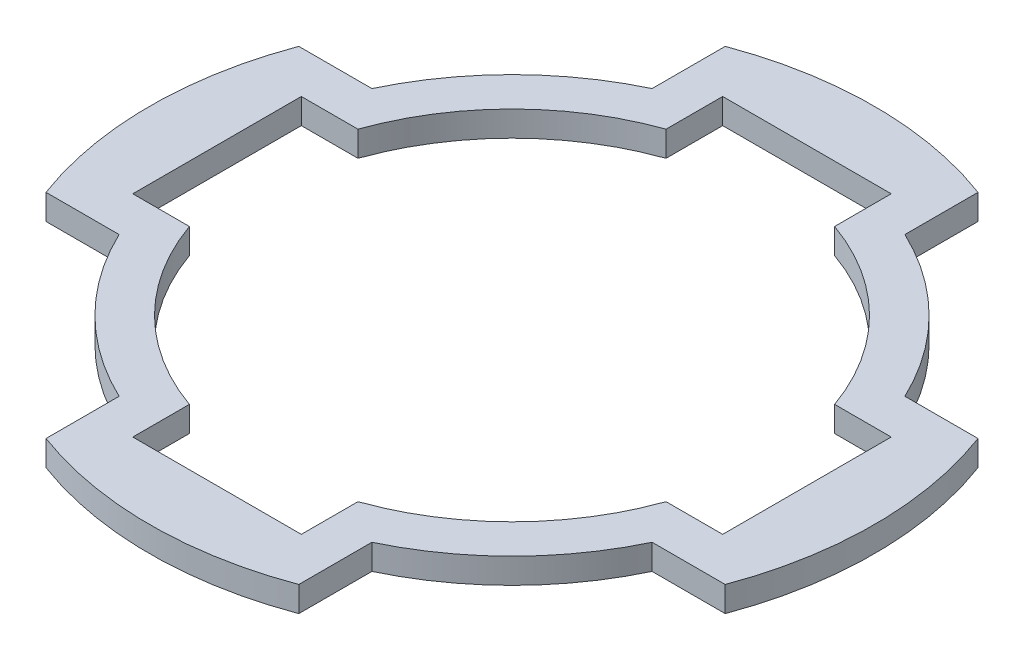
ISO-10303-21;
HEADER;
FILE_DESCRIPTION(('STEP AP214'),'2;1');
FILE_NAME('part.step','',(''),(''),'','','');
FILE_SCHEMA(('AUTOMOTIVE_DESIGN { 1 0 10303 214 1 1 1 1 }'));
ENDSEC;
DATA;
#1=APPLICATION_CONTEXT('core data for automotive mechanical design processes');
#2=APPLICATION_PROTOCOL_DEFINITION('international standard','automotive_design',2000,#1);
#3=PRODUCT_CONTEXT('',#1,'mechanical');
#4=PRODUCT('Part','Part','',(#3));
#5=PRODUCT_RELATED_PRODUCT_CATEGORY('part','',(#4));
#6=PRODUCT_DEFINITION_FORMATION('','',#4);
#7=PRODUCT_DEFINITION_CONTEXT('part definition',#1,'design');
#8=PRODUCT_DEFINITION('design','',#6,#7);
#9=PRODUCT_DEFINITION_SHAPE('','',#8);
#10=(LENGTH_UNIT() NAMED_UNIT(*) SI_UNIT(.MILLI.,.METRE.));
#11=(NAMED_UNIT(*) PLANE_ANGLE_UNIT() SI_UNIT($,.RADIAN.));
#12=(NAMED_UNIT(*) SI_UNIT($,.STERADIAN.) SOLID_ANGLE_UNIT());
#13=UNCERTAINTY_MEASURE_WITH_UNIT(LENGTH_MEASURE(1.E-05),#10,'distance_accuracy_value','');
#14=(GEOMETRIC_REPRESENTATION_CONTEXT(3) GLOBAL_UNCERTAINTY_ASSIGNED_CONTEXT((#13)) GLOBAL_UNIT_ASSIGNED_CONTEXT((#10,
#11,#12)) REPRESENTATION_CONTEXT('',''));
#15=CARTESIAN_POINT('',(0.,0.,0.));
#16=DIRECTION('',(0.,0.,1.));
#17=DIRECTION('',(1.,0.,0.));
#18=AXIS2_PLACEMENT_3D('',#15,#16,#17);
#19=CARTESIAN_POINT('',(0.,0.3,0.));
#20=DIRECTION('',(0.,1.,0.));
#21=DIRECTION('',(0.,0.,1.));
#22=AXIS2_PLACEMENT_3D('',#19,#20,#21);
#23=PLANE('',#22);
#24=CARTESIAN_POINT('',(0.,0.3,0.));
#25=DIRECTION('',(0.,1.,0.));
#26=DIRECTION('',(0.,0.,1.));
#27=AXIS2_PLACEMENT_3D('',#24,#25,#26);
#28=CIRCLE('',#27,3.5);
#29=CARTESIAN_POINT('',(-3.16227766016838,0.3,1.5));
#30=VERTEX_POINT('',#29);
#31=CARTESIAN_POINT('',(-1.5,0.3,3.16227766016838));
#32=VERTEX_POINT('',#31);
#33=EDGE_CURVE('E363',#30,#32,#28,.T.);
#34=ORIENTED_EDGE('',*,*,#33,.T.);
#35=DIRECTION('',(0.,0.,1.));
#36=VECTOR('',#35,1.);
#37=CARTESIAN_POINT('',(-1.5,0.3,3.16227766016838));
#38=LINE('',#37,#36);
#39=CARTESIAN_POINT('',(-1.5,0.3,4.02988833592198));
#40=VERTEX_POINT('',#39);
#41=EDGE_CURVE('E366',#32,#40,#38,.T.);
#42=ORIENTED_EDGE('',*,*,#41,.T.);
#43=CARTESIAN_POINT('',(0.,0.3,0.));
#44=DIRECTION('',(0.,1.,0.));
#45=DIRECTION('',(0.,0.,1.));
#46=AXIS2_PLACEMENT_3D('',#43,#44,#45);
#47=CIRCLE('',#46,4.3);
#48=CARTESIAN_POINT('',(1.5,0.3,4.02988833592198));
#49=VERTEX_POINT('',#48);
#50=EDGE_CURVE('E369',#40,#49,#47,.T.);
#51=ORIENTED_EDGE('',*,*,#50,.T.);
#52=DIRECTION('',(0.,0.,-1.));
#53=VECTOR('',#52,1.);
#54=CARTESIAN_POINT('',(1.5,0.3,3.16227766016838));
#55=LINE('',#54,#53);
#56=CARTESIAN_POINT('',(1.5,0.3,3.16227766016838));
#57=VERTEX_POINT('',#56);
#58=EDGE_CURVE('E371',#49,#57,#55,.T.);
#59=ORIENTED_EDGE('',*,*,#58,.T.);
#60=CARTESIAN_POINT('',(0.,0.3,0.));
#61=DIRECTION('',(0.,1.,0.));
#62=DIRECTION('',(0.,0.,1.));
#63=AXIS2_PLACEMENT_3D('',#60,#61,#62);
#64=CIRCLE('',#63,3.5);
#65=CARTESIAN_POINT('',(3.16227766016838,0.3,1.5));
#66=VERTEX_POINT('',#65);
#67=EDGE_CURVE('E373',#57,#66,#64,.T.);
#68=ORIENTED_EDGE('',*,*,#67,.T.);
#69=DIRECTION('',(1.,0.,0.));
#70=VECTOR('',#69,1.);
#71=CARTESIAN_POINT('',(3.16227766016838,0.3,1.5));
#72=LINE('',#71,#70);
#73=CARTESIAN_POINT('',(4.02988833592198,0.3,1.5));
#74=VERTEX_POINT('',#73);
#75=EDGE_CURVE('E375',#66,#74,#72,.T.);
#76=ORIENTED_EDGE('',*,*,#75,.T.);
#77=CARTESIAN_POINT('',(0.,0.3,0.));
#78=DIRECTION('',(0.,1.,0.));
#79=DIRECTION('',(0.,0.,1.));
#80=AXIS2_PLACEMENT_3D('',#77,#78,#79);
#81=CIRCLE('',#80,4.3);
#82=CARTESIAN_POINT('',(4.02988833592198,0.3,-1.5));
#83=VERTEX_POINT('',#82);
#84=EDGE_CURVE('E377',#74,#83,#81,.T.);
#85=ORIENTED_EDGE('',*,*,#84,.T.);
#86=DIRECTION('',(-1.,0.,0.));
#87=VECTOR('',#86,1.);
#88=CARTESIAN_POINT('',(3.16227766016838,0.3,-1.5));
#89=LINE('',#88,#87);
#90=CARTESIAN_POINT('',(3.16227766016838,0.3,-1.5));
#91=VERTEX_POINT('',#90);
#92=EDGE_CURVE('E379',#83,#91,#89,.T.);
#93=ORIENTED_EDGE('',*,*,#92,.T.);
#94=CARTESIAN_POINT('',(0.,0.3,0.));
#95=DIRECTION('',(0.,1.,0.));
#96=DIRECTION('',(0.,0.,1.));
#97=AXIS2_PLACEMENT_3D('',#94,#95,#96);
#98=CIRCLE('',#97,3.5);
#99=CARTESIAN_POINT('',(1.5,0.3,-3.16227766016838));
#100=VERTEX_POINT('',#99);
#101=EDGE_CURVE('E381',#91,#100,#98,.T.);
#102=ORIENTED_EDGE('',*,*,#101,.T.);
#103=DIRECTION('',(0.,0.,-1.));
#104=VECTOR('',#103,1.);
#105=CARTESIAN_POINT('',(1.5,0.3,-4.02988833592198));
#106=LINE('',#105,#104);
#107=CARTESIAN_POINT('',(1.5,0.3,-4.02988833592198));
#108=VERTEX_POINT('',#107);
#109=EDGE_CURVE('E383',#100,#108,#106,.T.);
#110=ORIENTED_EDGE('',*,*,#109,.T.);
#111=CARTESIAN_POINT('',(0.,0.3,0.));
#112=DIRECTION('',(0.,1.,0.));
#113=DIRECTION('',(0.,0.,1.));
#114=AXIS2_PLACEMENT_3D('',#111,#112,#113);
#115=CIRCLE('',#114,4.3);
#116=CARTESIAN_POINT('',(-1.5,0.3,-4.02988833592198));
#117=VERTEX_POINT('',#116);
#118=EDGE_CURVE('E385',#108,#117,#115,.T.);
#119=ORIENTED_EDGE('',*,*,#118,.T.);
#120=DIRECTION('',(0.,0.,1.));
#121=VECTOR('',#120,1.);
#122=CARTESIAN_POINT('',(-1.5,0.3,-4.02988833592198));
#123=LINE('',#122,#121);
#124=CARTESIAN_POINT('',(-1.5,0.3,-3.16227766016838));
#125=VERTEX_POINT('',#124);
#126=EDGE_CURVE('E387',#117,#125,#123,.T.);
#127=ORIENTED_EDGE('',*,*,#126,.T.);
#128=CARTESIAN_POINT('',(0.,0.3,0.));
#129=DIRECTION('',(0.,1.,0.));
#130=DIRECTION('',(0.,0.,1.));
#131=AXIS2_PLACEMENT_3D('',#128,#129,#130);
#132=CIRCLE('',#131,3.5);
#133=CARTESIAN_POINT('',(-3.16227766016838,0.3,-1.5));
#134=VERTEX_POINT('',#133);
#135=EDGE_CURVE('E389',#125,#134,#132,.T.);
#136=ORIENTED_EDGE('',*,*,#135,.T.);
#137=DIRECTION('',(-1.,0.,0.));
#138=VECTOR('',#137,1.);
#139=CARTESIAN_POINT('',(-4.02988833592198,0.3,-1.5));
#140=LINE('',#139,#138);
#141=CARTESIAN_POINT('',(-4.02988833592198,0.3,-1.5));
#142=VERTEX_POINT('',#141);
#143=EDGE_CURVE('E391',#134,#142,#140,.T.);
#144=ORIENTED_EDGE('',*,*,#143,.T.);
#145=CARTESIAN_POINT('',(0.,0.3,0.));
#146=DIRECTION('',(0.,1.,0.));
#147=DIRECTION('',(0.,0.,1.));
#148=AXIS2_PLACEMENT_3D('',#145,#146,#147);
#149=CIRCLE('',#148,4.3);
#150=CARTESIAN_POINT('',(-4.02988833592198,0.3,1.5));
#151=VERTEX_POINT('',#150);
#152=EDGE_CURVE('E393',#142,#151,#149,.T.);
#153=ORIENTED_EDGE('',*,*,#152,.T.);
#154=DIRECTION('',(1.,0.,0.));
#155=VECTOR('',#154,1.);
#156=CARTESIAN_POINT('',(-4.02988833592198,0.3,1.5));
#157=LINE('',#156,#155);
#158=EDGE_CURVE('E395',#151,#30,#157,.T.);
#159=ORIENTED_EDGE('',*,*,#158,.T.);
#160=EDGE_LOOP('',(#34,#42,#51,#59,#68,#76,#85,#93,#102,#110,#119,#127,#136,#144,#153,#159));
#161=FACE_BOUND('',#160,.T.);
#162=DIRECTION('',(1.,0.,0.));
#163=VECTOR('',#162,1.);
#164=CARTESIAN_POINT('',(2.82842712474619,0.3,1.));
#165=LINE('',#164,#163);
#166=CARTESIAN_POINT('',(2.82842712474619,0.3,1.));
#167=VERTEX_POINT('',#166);
#168=CARTESIAN_POINT('',(3.5,0.3,1.));
#169=VERTEX_POINT('',#168);
#170=EDGE_CURVE('E250',#167,#169,#165,.T.);
#171=ORIENTED_EDGE('',*,*,#170,.F.);
#172=CARTESIAN_POINT('',(0.,0.3,0.));
#173=DIRECTION('',(0.,1.,0.));
#174=DIRECTION('',(0.,0.,1.));
#175=AXIS2_PLACEMENT_3D('',#172,#173,#174);
#176=CIRCLE('',#175,3.);
#177=CARTESIAN_POINT('',(1.,0.3,2.82842712474619));
#178=VERTEX_POINT('',#177);
#179=EDGE_CURVE('E242',#178,#167,#176,.T.);
#180=ORIENTED_EDGE('',*,*,#179,.F.);
#181=DIRECTION('',(0.,0.,-1.));
#182=VECTOR('',#181,1.);
#183=CARTESIAN_POINT('',(1.,0.3,2.82842712474619));
#184=LINE('',#183,#182);
#185=CARTESIAN_POINT('',(1.,0.3,3.5));
#186=VERTEX_POINT('',#185);
#187=EDGE_CURVE('E291',#186,#178,#184,.T.);
#188=ORIENTED_EDGE('',*,*,#187,.F.);
#189=DIRECTION('',(1.,0.,0.));
#190=VECTOR('',#189,1.);
#191=CARTESIAN_POINT('',(-1.00000000000001,0.3,3.5));
#192=LINE('',#191,#190);
#193=CARTESIAN_POINT('',(-1.00000000000001,0.3,3.5));
#194=VERTEX_POINT('',#193);
#195=EDGE_CURVE('E289',#194,#186,#192,.T.);
#196=ORIENTED_EDGE('',*,*,#195,.F.);
#197=DIRECTION('',(0.,0.,1.));
#198=VECTOR('',#197,1.);
#199=CARTESIAN_POINT('',(-1.00000000000001,0.3,2.82842712474619));
#200=LINE('',#199,#198);
#201=CARTESIAN_POINT('',(-1.00000000000001,0.3,2.82842712474619));
#202=VERTEX_POINT('',#201);
#203=EDGE_CURVE('E287',#202,#194,#200,.T.);
#204=ORIENTED_EDGE('',*,*,#203,.F.);
#205=CARTESIAN_POINT('',(0.,0.3,0.));
#206=DIRECTION('',(0.,1.,0.));
#207=DIRECTION('',(0.,0.,1.));
#208=AXIS2_PLACEMENT_3D('',#205,#206,#207);
#209=CIRCLE('',#208,3.);
#210=CARTESIAN_POINT('',(-2.82842712474619,0.3,1.));
#211=VERTEX_POINT('',#210);
#212=EDGE_CURVE('E285',#211,#202,#209,.T.);
#213=ORIENTED_EDGE('',*,*,#212,.F.);
#214=DIRECTION('',(1.,0.,0.));
#215=VECTOR('',#214,1.);
#216=CARTESIAN_POINT('',(-3.5,0.3,1.));
#217=LINE('',#216,#215);
#218=CARTESIAN_POINT('',(-3.5,0.3,1.));
#219=VERTEX_POINT('',#218);
#220=EDGE_CURVE('E283',#219,#211,#217,.T.);
#221=ORIENTED_EDGE('',*,*,#220,.F.);
#222=DIRECTION('',(0.,0.,1.));
#223=VECTOR('',#222,1.);
#224=CARTESIAN_POINT('',(-3.5,0.3,-1.));
#225=LINE('',#224,#223);
#226=CARTESIAN_POINT('',(-3.5,0.3,-1.));
#227=VERTEX_POINT('',#226);
#228=EDGE_CURVE('E281',#227,#219,#225,.T.);
#229=ORIENTED_EDGE('',*,*,#228,.F.);
#230=DIRECTION('',(-1.,0.,0.));
#231=VECTOR('',#230,1.);
#232=CARTESIAN_POINT('',(-3.5,0.3,-1.));
#233=LINE('',#232,#231);
#234=CARTESIAN_POINT('',(-2.82842712474619,0.3,-1.));
#235=VERTEX_POINT('',#234);
#236=EDGE_CURVE('E279',#235,#227,#233,.T.);
#237=ORIENTED_EDGE('',*,*,#236,.F.);
#238=CARTESIAN_POINT('',(0.,0.3,0.));
#239=DIRECTION('',(0.,1.,0.));
#240=DIRECTION('',(0.,0.,1.));
#241=AXIS2_PLACEMENT_3D('',#238,#239,#240);
#242=CIRCLE('',#241,3.);
#243=CARTESIAN_POINT('',(-1.,0.3,-2.82842712474619));
#244=VERTEX_POINT('',#243);
#245=EDGE_CURVE('E277',#244,#235,#242,.T.);
#246=ORIENTED_EDGE('',*,*,#245,.F.);
#247=DIRECTION('',(0.,0.,1.));
#248=VECTOR('',#247,1.);
#249=CARTESIAN_POINT('',(-1.,0.3,-3.5));
#250=LINE('',#249,#248);
#251=CARTESIAN_POINT('',(-1.,0.3,-3.5));
#252=VERTEX_POINT('',#251);
#253=EDGE_CURVE('E275',#252,#244,#250,.T.);
#254=ORIENTED_EDGE('',*,*,#253,.F.);
#255=DIRECTION('',(-1.,0.,0.));
#256=VECTOR('',#255,1.);
#257=CARTESIAN_POINT('',(-1.,0.3,-3.5));
#258=LINE('',#257,#256);
#259=CARTESIAN_POINT('',(1.,0.3,-3.5));
#260=VERTEX_POINT('',#259);
#261=EDGE_CURVE('E273',#260,#252,#258,.T.);
#262=ORIENTED_EDGE('',*,*,#261,.F.);
#263=DIRECTION('',(0.,0.,-1.));
#264=VECTOR('',#263,1.);
#265=CARTESIAN_POINT('',(1.,0.3,-3.5));
#266=LINE('',#265,#264);
#267=CARTESIAN_POINT('',(0.999999999999999,0.3,-2.82842712474619));
#268=VERTEX_POINT('',#267);
#269=EDGE_CURVE('E271',#268,#260,#266,.T.);
#270=ORIENTED_EDGE('',*,*,#269,.F.);
#271=CARTESIAN_POINT('',(0.,0.3,0.));
#272=DIRECTION('',(0.,1.,0.));
#273=DIRECTION('',(0.,0.,1.));
#274=AXIS2_PLACEMENT_3D('',#271,#272,#273);
#275=CIRCLE('',#274,3.);
#276=CARTESIAN_POINT('',(2.82842712474619,0.3,-0.999999999999999));
#277=VERTEX_POINT('',#276);
#278=EDGE_CURVE('E269',#277,#268,#275,.T.);
#279=ORIENTED_EDGE('',*,*,#278,.F.);
#280=DIRECTION('',(-1.,0.,0.));
#281=VECTOR('',#280,1.);
#282=CARTESIAN_POINT('',(2.82842712474619,0.3,-0.999999999999999));
#283=LINE('',#282,#281);
#284=CARTESIAN_POINT('',(3.5,0.3,-0.999999999999999));
#285=VERTEX_POINT('',#284);
#286=EDGE_CURVE('E265',#285,#277,#283,.T.);
#287=ORIENTED_EDGE('',*,*,#286,.F.);
#288=DIRECTION('',(0.,0.,-1.));
#289=VECTOR('',#288,1.);
#290=CARTESIAN_POINT('',(3.5,0.3,-0.999999999999999));
#291=LINE('',#290,#289);
#292=EDGE_CURVE('E263',#169,#285,#291,.T.);
#293=ORIENTED_EDGE('',*,*,#292,.F.);
#294=EDGE_LOOP('',(#171,#180,#188,#196,#204,#213,#221,#229,#237,#246,#254,#262,#270,#279,#287,#293));
#295=FACE_BOUND('',#294,.T.);
#296=ADVANCED_FACE('F33',(#161,#295),#23,.T.);
#297=CARTESIAN_POINT('',(0.,0.,0.));
#298=DIRECTION('',(0.,1.,0.));
#299=DIRECTION('',(0.,0.,1.));
#300=AXIS2_PLACEMENT_3D('',#297,#298,#299);
#301=PLANE('',#300);
#302=CARTESIAN_POINT('',(0.,0.,0.));
#303=DIRECTION('',(0.,1.,0.));
#304=DIRECTION('',(0.,0.,1.));
#305=AXIS2_PLACEMENT_3D('',#302,#303,#304);
#306=CIRCLE('',#305,3.5);
#307=CARTESIAN_POINT('',(-3.16227766016838,0.,1.5));
#308=VERTEX_POINT('',#307);
#309=CARTESIAN_POINT('',(-1.5,0.,3.16227766016838));
#310=VERTEX_POINT('',#309);
#311=EDGE_CURVE('E258',#308,#310,#306,.T.);
#312=ORIENTED_EDGE('',*,*,#311,.F.);
#313=DIRECTION('',(1.,0.,0.));
#314=VECTOR('',#313,1.);
#315=CARTESIAN_POINT('',(-4.02988833592198,0.,1.5));
#316=LINE('',#315,#314);
#317=CARTESIAN_POINT('',(-4.02988833592198,0.,1.5));
#318=VERTEX_POINT('',#317);
#319=EDGE_CURVE('E367',#318,#308,#316,.T.);
#320=ORIENTED_EDGE('',*,*,#319,.F.);
#321=CARTESIAN_POINT('',(0.,0.,0.));
#322=DIRECTION('',(0.,1.,0.));
#323=DIRECTION('',(0.,0.,1.));
#324=AXIS2_PLACEMENT_3D('',#321,#322,#323);
#325=CIRCLE('',#324,4.3);
#326=CARTESIAN_POINT('',(-4.02988833592198,0.,-1.5));
#327=VERTEX_POINT('',#326);
#328=EDGE_CURVE('E426',#327,#318,#325,.T.);
#329=ORIENTED_EDGE('',*,*,#328,.F.);
#330=DIRECTION('',(-1.,0.,0.));
#331=VECTOR('',#330,1.);
#332=CARTESIAN_POINT('',(-4.02988833592198,0.,-1.5));
#333=LINE('',#332,#331);
#334=CARTESIAN_POINT('',(-3.16227766016838,0.,-1.5));
#335=VERTEX_POINT('',#334);
#336=EDGE_CURVE('E424',#335,#327,#333,.T.);
#337=ORIENTED_EDGE('',*,*,#336,.F.);
#338=CARTESIAN_POINT('',(0.,0.,0.));
#339=DIRECTION('',(0.,1.,0.));
#340=DIRECTION('',(0.,0.,1.));
#341=AXIS2_PLACEMENT_3D('',#338,#339,#340);
#342=CIRCLE('',#341,3.5);
#343=CARTESIAN_POINT('',(-1.5,0.,-3.16227766016838));
#344=VERTEX_POINT('',#343);
#345=EDGE_CURVE('E422',#344,#335,#342,.T.);
#346=ORIENTED_EDGE('',*,*,#345,.F.);
#347=DIRECTION('',(0.,0.,1.));
#348=VECTOR('',#347,1.);
#349=CARTESIAN_POINT('',(-1.5,0.,-4.02988833592198));
#350=LINE('',#349,#348);
#351=CARTESIAN_POINT('',(-1.5,0.,-4.02988833592198));
#352=VERTEX_POINT('',#351);
#353=EDGE_CURVE('E420',#352,#344,#350,.T.);
#354=ORIENTED_EDGE('',*,*,#353,.F.);
#355=CARTESIAN_POINT('',(0.,0.,0.));
#356=DIRECTION('',(0.,1.,0.));
#357=DIRECTION('',(0.,0.,1.));
#358=AXIS2_PLACEMENT_3D('',#355,#356,#357);
#359=CIRCLE('',#358,4.3);
#360=CARTESIAN_POINT('',(1.5,0.,-4.02988833592198));
#361=VERTEX_POINT('',#360);
#362=EDGE_CURVE('E418',#361,#352,#359,.T.);
#363=ORIENTED_EDGE('',*,*,#362,.F.);
#364=DIRECTION('',(0.,0.,-1.));
#365=VECTOR('',#364,1.);
#366=CARTESIAN_POINT('',(1.5,0.,-4.02988833592198));
#367=LINE('',#366,#365);
#368=CARTESIAN_POINT('',(1.5,0.,-3.16227766016838));
#369=VERTEX_POINT('',#368);
#370=EDGE_CURVE('E416',#369,#361,#367,.T.);
#371=ORIENTED_EDGE('',*,*,#370,.F.);
#372=CARTESIAN_POINT('',(0.,0.,0.));
#373=DIRECTION('',(0.,1.,0.));
#374=DIRECTION('',(0.,0.,1.));
#375=AXIS2_PLACEMENT_3D('',#372,#373,#374);
#376=CIRCLE('',#375,3.5);
#377=CARTESIAN_POINT('',(3.16227766016838,0.,-1.5));
#378=VERTEX_POINT('',#377);
#379=EDGE_CURVE('E414',#378,#369,#376,.T.);
#380=ORIENTED_EDGE('',*,*,#379,.F.);
#381=DIRECTION('',(-1.,0.,0.));
#382=VECTOR('',#381,1.);
#383=CARTESIAN_POINT('',(3.16227766016838,0.,-1.5));
#384=LINE('',#383,#382);
#385=CARTESIAN_POINT('',(4.02988833592198,0.,-1.5));
#386=VERTEX_POINT('',#385);
#387=EDGE_CURVE('E412',#386,#378,#384,.T.);
#388=ORIENTED_EDGE('',*,*,#387,.F.);
#389=CARTESIAN_POINT('',(0.,0.,0.));
#390=DIRECTION('',(0.,1.,0.));
#391=DIRECTION('',(0.,0.,1.));
#392=AXIS2_PLACEMENT_3D('',#389,#390,#391);
#393=CIRCLE('',#392,4.3);
#394=CARTESIAN_POINT('',(4.02988833592198,0.,1.5));
#395=VERTEX_POINT('',#394);
#396=EDGE_CURVE('E410',#395,#386,#393,.T.);
#397=ORIENTED_EDGE('',*,*,#396,.F.);
#398=DIRECTION('',(1.,0.,0.));
#399=VECTOR('',#398,1.);
#400=CARTESIAN_POINT('',(3.16227766016838,0.,1.5));
#401=LINE('',#400,#399);
#402=CARTESIAN_POINT('',(3.16227766016838,0.,1.5));
#403=VERTEX_POINT('',#402);
#404=EDGE_CURVE('E408',#403,#395,#401,.T.);
#405=ORIENTED_EDGE('',*,*,#404,.F.);
#406=CARTESIAN_POINT('',(0.,0.,0.));
#407=DIRECTION('',(0.,1.,0.));
#408=DIRECTION('',(0.,0.,1.));
#409=AXIS2_PLACEMENT_3D('',#406,#407,#408);
#410=CIRCLE('',#409,3.5);
#411=CARTESIAN_POINT('',(1.5,0.,3.16227766016838));
#412=VERTEX_POINT('',#411);
#413=EDGE_CURVE('E406',#412,#403,#410,.T.);
#414=ORIENTED_EDGE('',*,*,#413,.F.);
#415=DIRECTION('',(0.,0.,-1.));
#416=VECTOR('',#415,1.);
#417=CARTESIAN_POINT('',(1.5,0.,3.16227766016838));
#418=LINE('',#417,#416);
#419=CARTESIAN_POINT('',(1.5,0.,4.02988833592198));
#420=VERTEX_POINT('',#419);
#421=EDGE_CURVE('E404',#420,#412,#418,.T.);
#422=ORIENTED_EDGE('',*,*,#421,.F.);
#423=CARTESIAN_POINT('',(0.,0.,0.));
#424=DIRECTION('',(0.,1.,0.));
#425=DIRECTION('',(0.,0.,1.));
#426=AXIS2_PLACEMENT_3D('',#423,#424,#425);
#427=CIRCLE('',#426,4.3);
#428=CARTESIAN_POINT('',(-1.5,0.,4.02988833592198));
#429=VERTEX_POINT('',#428);
#430=EDGE_CURVE('E402',#429,#420,#427,.T.);
#431=ORIENTED_EDGE('',*,*,#430,.F.);
#432=DIRECTION('',(0.,0.,1.));
#433=VECTOR('',#432,1.);
#434=CARTESIAN_POINT('',(-1.5,0.,3.16227766016838));
#435=LINE('',#434,#433);
#436=EDGE_CURVE('E400',#310,#429,#435,.T.);
#437=ORIENTED_EDGE('',*,*,#436,.F.);
#438=EDGE_LOOP('',(#312,#320,#329,#337,#346,#354,#363,#371,#380,#388,#397,#405,#414,#422,#431,#437));
#439=FACE_BOUND('',#438,.T.);
#440=CARTESIAN_POINT('',(0.,0.,0.));
#441=DIRECTION('',(0.,1.,0.));
#442=DIRECTION('',(0.,0.,1.));
#443=AXIS2_PLACEMENT_3D('',#440,#441,#442);
#444=CIRCLE('',#443,3.);
#445=CARTESIAN_POINT('',(1.,0.,2.82842712474619));
#446=VERTEX_POINT('',#445);
#447=CARTESIAN_POINT('',(2.82842712474619,0.,1.));
#448=VERTEX_POINT('',#447);
#449=EDGE_CURVE('E56',#446,#448,#444,.T.);
#450=ORIENTED_EDGE('',*,*,#449,.T.);
#451=DIRECTION('',(1.,0.,0.));
#452=VECTOR('',#451,1.);
#453=CARTESIAN_POINT('',(2.82842712474619,0.,1.));
#454=LINE('',#453,#452);
#455=CARTESIAN_POINT('',(3.5,0.,1.));
#456=VERTEX_POINT('',#455);
#457=EDGE_CURVE('E257',#448,#456,#454,.T.);
#458=ORIENTED_EDGE('',*,*,#457,.T.);
#459=DIRECTION('',(0.,0.,-1.));
#460=VECTOR('',#459,1.);
#461=CARTESIAN_POINT('',(3.5,0.,-0.999999999999999));
#462=LINE('',#461,#460);
#463=CARTESIAN_POINT('',(3.5,0.,-0.999999999999999));
#464=VERTEX_POINT('',#463);
#465=EDGE_CURVE('E295',#456,#464,#462,.T.);
#466=ORIENTED_EDGE('',*,*,#465,.T.);
#467=DIRECTION('',(-1.,0.,0.));
#468=VECTOR('',#467,1.);
#469=CARTESIAN_POINT('',(2.82842712474619,0.,-0.999999999999999));
#470=LINE('',#469,#468);
#471=CARTESIAN_POINT('',(2.82842712474619,0.,-0.999999999999999));
#472=VERTEX_POINT('',#471);
#473=EDGE_CURVE('E298',#464,#472,#470,.T.);
#474=ORIENTED_EDGE('',*,*,#473,.T.);
#475=CARTESIAN_POINT('',(0.,0.,0.));
#476=DIRECTION('',(0.,1.,0.));
#477=DIRECTION('',(0.,0.,1.));
#478=AXIS2_PLACEMENT_3D('',#475,#476,#477);
#479=CIRCLE('',#478,3.);
#480=CARTESIAN_POINT('',(0.999999999999999,0.,-2.82842712474619));
#481=VERTEX_POINT('',#480);
#482=EDGE_CURVE('E301',#472,#481,#479,.T.);
#483=ORIENTED_EDGE('',*,*,#482,.T.);
#484=DIRECTION('',(0.,0.,-1.));
#485=VECTOR('',#484,1.);
#486=CARTESIAN_POINT('',(1.,0.,-3.5));
#487=LINE('',#486,#485);
#488=CARTESIAN_POINT('',(1.,0.,-3.5));
#489=VERTEX_POINT('',#488);
#490=EDGE_CURVE('E304',#481,#489,#487,.T.);
#491=ORIENTED_EDGE('',*,*,#490,.T.);
#492=DIRECTION('',(-1.,0.,0.));
#493=VECTOR('',#492,1.);
#494=CARTESIAN_POINT('',(-1.,0.,-3.5));
#495=LINE('',#494,#493);
#496=CARTESIAN_POINT('',(-1.,0.,-3.5));
#497=VERTEX_POINT('',#496);
#498=EDGE_CURVE('E307',#489,#497,#495,.T.);
#499=ORIENTED_EDGE('',*,*,#498,.T.);
#500=DIRECTION('',(0.,0.,1.));
#501=VECTOR('',#500,1.);
#502=CARTESIAN_POINT('',(-1.,0.,-3.5));
#503=LINE('',#502,#501);
#504=CARTESIAN_POINT('',(-1.,0.,-2.82842712474619));
#505=VERTEX_POINT('',#504);
#506=EDGE_CURVE('E310',#497,#505,#503,.T.);
#507=ORIENTED_EDGE('',*,*,#506,.T.);
#508=CARTESIAN_POINT('',(0.,0.,0.));
#509=DIRECTION('',(0.,1.,0.));
#510=DIRECTION('',(0.,0.,1.));
#511=AXIS2_PLACEMENT_3D('',#508,#509,#510);
#512=CIRCLE('',#511,3.);
#513=CARTESIAN_POINT('',(-2.82842712474619,0.,-1.));
#514=VERTEX_POINT('',#513);
#515=EDGE_CURVE('E313',#505,#514,#512,.T.);
#516=ORIENTED_EDGE('',*,*,#515,.T.);
#517=DIRECTION('',(-1.,0.,0.));
#518=VECTOR('',#517,1.);
#519=CARTESIAN_POINT('',(-3.5,0.,-1.));
#520=LINE('',#519,#518);
#521=CARTESIAN_POINT('',(-3.5,0.,-1.));
#522=VERTEX_POINT('',#521);
#523=EDGE_CURVE('E316',#514,#522,#520,.T.);
#524=ORIENTED_EDGE('',*,*,#523,.T.);
#525=DIRECTION('',(0.,0.,1.));
#526=VECTOR('',#525,1.);
#527=CARTESIAN_POINT('',(-3.5,0.,-1.));
#528=LINE('',#527,#526);
#529=CARTESIAN_POINT('',(-3.5,0.,1.));
#530=VERTEX_POINT('',#529);
#531=EDGE_CURVE('E319',#522,#530,#528,.T.);
#532=ORIENTED_EDGE('',*,*,#531,.T.);
#533=DIRECTION('',(1.,0.,0.));
#534=VECTOR('',#533,1.);
#535=CARTESIAN_POINT('',(-3.5,0.,1.));
#536=LINE('',#535,#534);
#537=CARTESIAN_POINT('',(-2.82842712474619,0.,1.));
#538=VERTEX_POINT('',#537);
#539=EDGE_CURVE('E322',#530,#538,#536,.T.);
#540=ORIENTED_EDGE('',*,*,#539,.T.);
#541=CARTESIAN_POINT('',(0.,0.,0.));
#542=DIRECTION('',(0.,1.,0.));
#543=DIRECTION('',(0.,0.,1.));
#544=AXIS2_PLACEMENT_3D('',#541,#542,#543);
#545=CIRCLE('',#544,3.);
#546=CARTESIAN_POINT('',(-1.00000000000001,0.,2.82842712474619));
#547=VERTEX_POINT('',#546);
#548=EDGE_CURVE('E325',#538,#547,#545,.T.);
#549=ORIENTED_EDGE('',*,*,#548,.T.);
#550=DIRECTION('',(0.,0.,1.));
#551=VECTOR('',#550,1.);
#552=CARTESIAN_POINT('',(-1.00000000000001,0.,2.82842712474619));
#553=LINE('',#552,#551);
#554=CARTESIAN_POINT('',(-1.00000000000001,0.,3.5));
#555=VERTEX_POINT('',#554);
#556=EDGE_CURVE('E328',#547,#555,#553,.T.);
#557=ORIENTED_EDGE('',*,*,#556,.T.);
#558=DIRECTION('',(1.,0.,0.));
#559=VECTOR('',#558,1.);
#560=CARTESIAN_POINT('',(-1.00000000000001,0.,3.5));
#561=LINE('',#560,#559);
#562=CARTESIAN_POINT('',(1.,0.,3.5));
#563=VERTEX_POINT('',#562);
#564=EDGE_CURVE('E331',#555,#563,#561,.T.);
#565=ORIENTED_EDGE('',*,*,#564,.T.);
#566=DIRECTION('',(0.,0.,-1.));
#567=VECTOR('',#566,1.);
#568=CARTESIAN_POINT('',(1.,0.,2.82842712474619));
#569=LINE('',#568,#567);
#570=EDGE_CURVE('E251',#563,#446,#569,.T.);
#571=ORIENTED_EDGE('',*,*,#570,.T.);
#572=EDGE_LOOP('',(#450,#458,#466,#474,#483,#491,#499,#507,#516,#524,#532,#540,#549,#557,#565,#571));
#573=FACE_BOUND('',#572,.T.);
#574=ADVANCED_FACE('F480',(#439,#573),#301,.F.);
#575=CARTESIAN_POINT('',(0.,0.3,0.));
#576=DIRECTION('',(0.,-1.,0.));
#577=DIRECTION('',(0.,0.,-1.));
#578=AXIS2_PLACEMENT_3D('',#575,#576,#577);
#579=CYLINDRICAL_SURFACE('',#578,3.5);
#580=ORIENTED_EDGE('',*,*,#311,.T.);
#581=DIRECTION('',(0.,-1.,0.));
#582=VECTOR('',#581,1.);
#583=CARTESIAN_POINT('',(-1.5,0.3,3.16227766016838));
#584=LINE('',#583,#582);
#585=EDGE_CURVE('E11',#32,#310,#584,.T.);
#586=ORIENTED_EDGE('',*,*,#585,.F.);
#587=ORIENTED_EDGE('',*,*,#33,.F.);
#588=DIRECTION('',(0.,-1.,0.));
#589=VECTOR('',#588,1.);
#590=CARTESIAN_POINT('',(-3.16227766016838,0.3,1.5));
#591=LINE('',#590,#589);
#592=EDGE_CURVE('E397',#30,#308,#591,.T.);
#593=ORIENTED_EDGE('',*,*,#592,.T.);
#594=EDGE_LOOP('',(#580,#586,#587,#593));
#595=FACE_BOUND('',#594,.T.);
#596=ADVANCED_FACE('F35',(#595),#579,.T.);
#597=CARTESIAN_POINT('',(-1.5,0.3,3.16227766016838));
#598=DIRECTION('',(1.,0.,0.));
#599=DIRECTION('',(0.,0.,-1.));
#600=AXIS2_PLACEMENT_3D('',#597,#598,#599);
#601=PLANE('',#600);
#602=ORIENTED_EDGE('',*,*,#436,.T.);
#603=DIRECTION('',(0.,-1.,0.));
#604=VECTOR('',#603,1.);
#605=CARTESIAN_POINT('',(-1.5,0.3,4.02988833592198));
#606=LINE('',#605,#604);
#607=EDGE_CURVE('E41',#40,#429,#606,.T.);
#608=ORIENTED_EDGE('',*,*,#607,.F.);
#609=ORIENTED_EDGE('',*,*,#41,.F.);
#610=ORIENTED_EDGE('',*,*,#585,.T.);
#611=EDGE_LOOP('',(#602,#608,#609,#610));
#612=FACE_BOUND('',#611,.T.);
#613=ADVANCED_FACE('F497',(#612),#601,.F.);
#614=CARTESIAN_POINT('',(0.,0.3,0.));
#615=DIRECTION('',(0.,-1.,0.));
#616=DIRECTION('',(0.,0.,-1.));
#617=AXIS2_PLACEMENT_3D('',#614,#615,#616);
#618=CYLINDRICAL_SURFACE('',#617,4.3);
#619=ORIENTED_EDGE('',*,*,#430,.T.);
#620=DIRECTION('',(0.,-1.,0.));
#621=VECTOR('',#620,1.);
#622=CARTESIAN_POINT('',(1.5,0.3,4.02988833592198));
#623=LINE('',#622,#621);
#624=EDGE_CURVE('E467',#49,#420,#623,.T.);
#625=ORIENTED_EDGE('',*,*,#624,.F.);
#626=ORIENTED_EDGE('',*,*,#50,.F.);
#627=ORIENTED_EDGE('',*,*,#607,.T.);
#628=EDGE_LOOP('',(#619,#625,#626,#627));
#629=FACE_BOUND('',#628,.T.);
#630=ADVANCED_FACE('F474',(#629),#618,.T.);
#631=CARTESIAN_POINT('',(1.5,0.3,3.16227766016838));
#632=DIRECTION('',(-1.,0.,0.));
#633=DIRECTION('',(0.,0.,1.));
#634=AXIS2_PLACEMENT_3D('',#631,#632,#633);
#635=PLANE('',#634);
#636=ORIENTED_EDGE('',*,*,#421,.T.);
#637=DIRECTION('',(0.,-1.,0.));
#638=VECTOR('',#637,1.);
#639=CARTESIAN_POINT('',(1.5,0.3,3.16227766016838));
#640=LINE('',#639,#638);
#641=EDGE_CURVE('E464',#57,#412,#640,.T.);
#642=ORIENTED_EDGE('',*,*,#641,.F.);
#643=ORIENTED_EDGE('',*,*,#58,.F.);
#644=ORIENTED_EDGE('',*,*,#624,.T.);
#645=EDGE_LOOP('',(#636,#642,#643,#644));
#646=FACE_BOUND('',#645,.T.);
#647=ADVANCED_FACE('F486',(#646),#635,.F.);
#648=CARTESIAN_POINT('',(0.,0.3,0.));
#649=DIRECTION('',(0.,-1.,0.));
#650=DIRECTION('',(0.,0.,-1.));
#651=AXIS2_PLACEMENT_3D('',#648,#649,#650);
#652=CYLINDRICAL_SURFACE('',#651,3.5);
#653=ORIENTED_EDGE('',*,*,#413,.T.);
#654=DIRECTION('',(0.,-1.,0.));
#655=VECTOR('',#654,1.);
#656=CARTESIAN_POINT('',(3.16227766016838,0.3,1.5));
#657=LINE('',#656,#655);
#658=EDGE_CURVE('E461',#66,#403,#657,.T.);
#659=ORIENTED_EDGE('',*,*,#658,.F.);
#660=ORIENTED_EDGE('',*,*,#67,.F.);
#661=ORIENTED_EDGE('',*,*,#641,.T.);
#662=EDGE_LOOP('',(#653,#659,#660,#661));
#663=FACE_BOUND('',#662,.T.);
#664=ADVANCED_FACE('F490',(#663),#652,.T.);
#665=CARTESIAN_POINT('',(3.16227766016838,0.3,1.5));
#666=DIRECTION('',(0.,0.,-1.));
#667=DIRECTION('',(-1.,0.,0.));
#668=AXIS2_PLACEMENT_3D('',#665,#666,#667);
#669=PLANE('',#668);
#670=ORIENTED_EDGE('',*,*,#404,.T.);
#671=DIRECTION('',(0.,-1.,0.));
#672=VECTOR('',#671,1.);
#673=CARTESIAN_POINT('',(4.02988833592198,0.3,1.5));
#674=LINE('',#673,#672);
#675=EDGE_CURVE('E458',#74,#395,#674,.T.);
#676=ORIENTED_EDGE('',*,*,#675,.F.);
#677=ORIENTED_EDGE('',*,*,#75,.F.);
#678=ORIENTED_EDGE('',*,*,#658,.T.);
#679=EDGE_LOOP('',(#670,#676,#677,#678));
#680=FACE_BOUND('',#679,.T.);
#681=ADVANCED_FACE('F550',(#680),#669,.F.);
#682=CARTESIAN_POINT('',(0.,0.3,0.));
#683=DIRECTION('',(0.,-1.,0.));
#684=DIRECTION('',(0.,0.,-1.));
#685=AXIS2_PLACEMENT_3D('',#682,#683,#684);
#686=CYLINDRICAL_SURFACE('',#685,4.3);
#687=ORIENTED_EDGE('',*,*,#396,.T.);
#688=DIRECTION('',(0.,-1.,0.));
#689=VECTOR('',#688,1.);
#690=CARTESIAN_POINT('',(4.02988833592198,0.3,-1.5));
#691=LINE('',#690,#689);
#692=EDGE_CURVE('E455',#83,#386,#691,.T.);
#693=ORIENTED_EDGE('',*,*,#692,.F.);
#694=ORIENTED_EDGE('',*,*,#84,.F.);
#695=ORIENTED_EDGE('',*,*,#675,.T.);
#696=EDGE_LOOP('',(#687,#693,#694,#695));
#697=FACE_BOUND('',#696,.T.);
#698=ADVANCED_FACE('F547',(#697),#686,.T.);
#699=CARTESIAN_POINT('',(3.16227766016838,0.3,-1.5));
#700=DIRECTION('',(0.,0.,1.));
#701=DIRECTION('',(1.,0.,0.));
#702=AXIS2_PLACEMENT_3D('',#699,#700,#701);
#703=PLANE('',#702);
#704=ORIENTED_EDGE('',*,*,#387,.T.);
#705=DIRECTION('',(0.,-1.,0.));
#706=VECTOR('',#705,1.);
#707=CARTESIAN_POINT('',(3.16227766016838,0.3,-1.5));
#708=LINE('',#707,#706);
#709=EDGE_CURVE('E452',#91,#378,#708,.T.);
#710=ORIENTED_EDGE('',*,*,#709,.F.);
#711=ORIENTED_EDGE('',*,*,#92,.F.);
#712=ORIENTED_EDGE('',*,*,#692,.T.);
#713=EDGE_LOOP('',(#704,#710,#711,#712));
#714=FACE_BOUND('',#713,.T.);
#715=ADVANCED_FACE('F543',(#714),#703,.F.);
#716=CARTESIAN_POINT('',(0.,0.3,0.));
#717=DIRECTION('',(0.,-1.,0.));
#718=DIRECTION('',(0.,0.,-1.));
#719=AXIS2_PLACEMENT_3D('',#716,#717,#718);
#720=CYLINDRICAL_SURFACE('',#719,3.5);
#721=ORIENTED_EDGE('',*,*,#379,.T.);
#722=DIRECTION('',(0.,-1.,0.));
#723=VECTOR('',#722,1.);
#724=CARTESIAN_POINT('',(1.5,0.3,-3.16227766016838));
#725=LINE('',#724,#723);
#726=EDGE_CURVE('E449',#100,#369,#725,.T.);
#727=ORIENTED_EDGE('',*,*,#726,.F.);
#728=ORIENTED_EDGE('',*,*,#101,.F.);
#729=ORIENTED_EDGE('',*,*,#709,.T.);
#730=EDGE_LOOP('',(#721,#727,#728,#729));
#731=FACE_BOUND('',#730,.T.);
#732=ADVANCED_FACE('F539',(#731),#720,.T.);
#733=CARTESIAN_POINT('',(1.5,0.3,-4.02988833592198));
#734=DIRECTION('',(-1.,0.,0.));
#735=DIRECTION('',(0.,0.,1.));
#736=AXIS2_PLACEMENT_3D('',#733,#734,#735);
#737=PLANE('',#736);
#738=ORIENTED_EDGE('',*,*,#370,.T.);
#739=DIRECTION('',(0.,-1.,0.));
#740=VECTOR('',#739,1.);
#741=CARTESIAN_POINT('',(1.5,0.3,-4.02988833592198));
#742=LINE('',#741,#740);
#743=EDGE_CURVE('E446',#108,#361,#742,.T.);
#744=ORIENTED_EDGE('',*,*,#743,.F.);
#745=ORIENTED_EDGE('',*,*,#109,.F.);
#746=ORIENTED_EDGE('',*,*,#726,.T.);
#747=EDGE_LOOP('',(#738,#744,#745,#746));
#748=FACE_BOUND('',#747,.T.);
#749=ADVANCED_FACE('F534',(#748),#737,.F.);
#750=CARTESIAN_POINT('',(0.,0.3,0.));
#751=DIRECTION('',(0.,-1.,0.));
#752=DIRECTION('',(0.,0.,-1.));
#753=AXIS2_PLACEMENT_3D('',#750,#751,#752);
#754=CYLINDRICAL_SURFACE('',#753,4.3);
#755=ORIENTED_EDGE('',*,*,#362,.T.);
#756=DIRECTION('',(0.,-1.,0.));
#757=VECTOR('',#756,1.);
#758=CARTESIAN_POINT('',(-1.5,0.3,-4.02988833592198));
#759=LINE('',#758,#757);
#760=EDGE_CURVE('E443',#117,#352,#759,.T.);
#761=ORIENTED_EDGE('',*,*,#760,.F.);
#762=ORIENTED_EDGE('',*,*,#118,.F.);
#763=ORIENTED_EDGE('',*,*,#743,.T.);
#764=EDGE_LOOP('',(#755,#761,#762,#763));
#765=FACE_BOUND('',#764,.T.);
#766=ADVANCED_FACE('F528',(#765),#754,.T.);
#767=CARTESIAN_POINT('',(-1.5,0.3,-4.02988833592198));
#768=DIRECTION('',(1.,0.,0.));
#769=DIRECTION('',(0.,0.,-1.));
#770=AXIS2_PLACEMENT_3D('',#767,#768,#769);
#771=PLANE('',#770);
#772=ORIENTED_EDGE('',*,*,#353,.T.);
#773=DIRECTION('',(0.,-1.,0.));
#774=VECTOR('',#773,1.);
#775=CARTESIAN_POINT('',(-1.5,0.3,-3.16227766016838));
#776=LINE('',#775,#774);
#777=EDGE_CURVE('E440',#125,#344,#776,.T.);
#778=ORIENTED_EDGE('',*,*,#777,.F.);
#779=ORIENTED_EDGE('',*,*,#126,.F.);
#780=ORIENTED_EDGE('',*,*,#760,.T.);
#781=EDGE_LOOP('',(#772,#778,#779,#780));
#782=FACE_BOUND('',#781,.T.);
#783=ADVANCED_FACE('F524',(#782),#771,.F.);
#784=CARTESIAN_POINT('',(0.,0.3,0.));
#785=DIRECTION('',(0.,-1.,0.));
#786=DIRECTION('',(0.,0.,-1.));
#787=AXIS2_PLACEMENT_3D('',#784,#785,#786);
#788=CYLINDRICAL_SURFACE('',#787,3.5);
#789=ORIENTED_EDGE('',*,*,#345,.T.);
#790=DIRECTION('',(0.,-1.,0.));
#791=VECTOR('',#790,1.);
#792=CARTESIAN_POINT('',(-3.16227766016838,0.3,-1.5));
#793=LINE('',#792,#791);
#794=EDGE_CURVE('E437',#134,#335,#793,.T.);
#795=ORIENTED_EDGE('',*,*,#794,.F.);
#796=ORIENTED_EDGE('',*,*,#135,.F.);
#797=ORIENTED_EDGE('',*,*,#777,.T.);
#798=EDGE_LOOP('',(#789,#795,#796,#797));
#799=FACE_BOUND('',#798,.T.);
#800=ADVANCED_FACE('F519',(#799),#788,.T.);
#801=CARTESIAN_POINT('',(-4.02988833592198,0.3,-1.5));
#802=DIRECTION('',(0.,0.,1.));
#803=DIRECTION('',(1.,0.,0.));
#804=AXIS2_PLACEMENT_3D('',#801,#802,#803);
#805=PLANE('',#804);
#806=ORIENTED_EDGE('',*,*,#336,.T.);
#807=DIRECTION('',(0.,-1.,0.));
#808=VECTOR('',#807,1.);
#809=CARTESIAN_POINT('',(-4.02988833592198,0.3,-1.5));
#810=LINE('',#809,#808);
#811=EDGE_CURVE('E434',#142,#327,#810,.T.);
#812=ORIENTED_EDGE('',*,*,#811,.F.);
#813=ORIENTED_EDGE('',*,*,#143,.F.);
#814=ORIENTED_EDGE('',*,*,#794,.T.);
#815=EDGE_LOOP('',(#806,#812,#813,#814));
#816=FACE_BOUND('',#815,.T.);
#817=ADVANCED_FACE('F513',(#816),#805,.F.);
#818=CARTESIAN_POINT('',(0.,0.3,0.));
#819=DIRECTION('',(0.,-1.,0.));
#820=DIRECTION('',(0.,0.,-1.));
#821=AXIS2_PLACEMENT_3D('',#818,#819,#820);
#822=CYLINDRICAL_SURFACE('',#821,4.3);
#823=ORIENTED_EDGE('',*,*,#328,.T.);
#824=DIRECTION('',(0.,-1.,0.));
#825=VECTOR('',#824,1.);
#826=CARTESIAN_POINT('',(-4.02988833592198,0.3,1.5));
#827=LINE('',#826,#825);
#828=EDGE_CURVE('E431',#151,#318,#827,.T.);
#829=ORIENTED_EDGE('',*,*,#828,.F.);
#830=ORIENTED_EDGE('',*,*,#152,.F.);
#831=ORIENTED_EDGE('',*,*,#811,.T.);
#832=EDGE_LOOP('',(#823,#829,#830,#831));
#833=FACE_BOUND('',#832,.T.);
#834=ADVANCED_FACE('F509',(#833),#822,.T.);
#835=CARTESIAN_POINT('',(-4.02988833592198,0.3,1.5));
#836=DIRECTION('',(0.,0.,-1.));
#837=DIRECTION('',(-1.,0.,0.));
#838=AXIS2_PLACEMENT_3D('',#835,#836,#837);
#839=PLANE('',#838);
#840=ORIENTED_EDGE('',*,*,#319,.T.);
#841=ORIENTED_EDGE('',*,*,#592,.F.);
#842=ORIENTED_EDGE('',*,*,#158,.F.);
#843=ORIENTED_EDGE('',*,*,#828,.T.);
#844=EDGE_LOOP('',(#840,#841,#842,#843));
#845=FACE_BOUND('',#844,.T.);
#846=ADVANCED_FACE('F504',(#845),#839,.F.);
#847=CARTESIAN_POINT('',(0.,0.3,0.));
#848=DIRECTION('',(0.,-1.,0.));
#849=DIRECTION('',(0.,0.,-1.));
#850=AXIS2_PLACEMENT_3D('',#847,#848,#849);
#851=CYLINDRICAL_SURFACE('',#850,3.);
#852=ORIENTED_EDGE('',*,*,#449,.F.);
#853=DIRECTION('',(0.,-1.,0.));
#854=VECTOR('',#853,1.);
#855=CARTESIAN_POINT('',(1.,0.3,2.82842712474619));
#856=LINE('',#855,#854);
#857=EDGE_CURVE('E246',#178,#446,#856,.T.);
#858=ORIENTED_EDGE('',*,*,#857,.F.);
#859=ORIENTED_EDGE('',*,*,#179,.T.);
#860=DIRECTION('',(0.,-1.,0.));
#861=VECTOR('',#860,1.);
#862=CARTESIAN_POINT('',(2.82842712474619,0.3,1.));
#863=LINE('',#862,#861);
#864=EDGE_CURVE('E245',#167,#448,#863,.T.);
#865=ORIENTED_EDGE('',*,*,#864,.T.);
#866=EDGE_LOOP('',(#852,#858,#859,#865));
#867=FACE_BOUND('',#866,.T.);
#868=ADVANCED_FACE('F244',(#867),#851,.F.);
#869=CARTESIAN_POINT('',(2.82842712474619,0.3,1.));
#870=DIRECTION('',(0.,0.,-1.));
#871=DIRECTION('',(-1.,0.,0.));
#872=AXIS2_PLACEMENT_3D('',#869,#870,#871);
#873=PLANE('',#872);
#874=ORIENTED_EDGE('',*,*,#457,.F.);
#875=ORIENTED_EDGE('',*,*,#864,.F.);
#876=ORIENTED_EDGE('',*,*,#170,.T.);
#877=DIRECTION('',(0.,-1.,0.));
#878=VECTOR('',#877,1.);
#879=CARTESIAN_POINT('',(3.5,0.3,1.));
#880=LINE('',#879,#878);
#881=EDGE_CURVE('E259',#169,#456,#880,.T.);
#882=ORIENTED_EDGE('',*,*,#881,.T.);
#883=EDGE_LOOP('',(#874,#875,#876,#882));
#884=FACE_BOUND('',#883,.T.);
#885=ADVANCED_FACE('F254',(#884),#873,.T.);
#886=CARTESIAN_POINT('',(3.5,0.3,-0.999999999999999));
#887=DIRECTION('',(-1.,0.,0.));
#888=DIRECTION('',(0.,0.,1.));
#889=AXIS2_PLACEMENT_3D('',#886,#887,#888);
#890=PLANE('',#889);
#891=ORIENTED_EDGE('',*,*,#465,.F.);
#892=ORIENTED_EDGE('',*,*,#881,.F.);
#893=ORIENTED_EDGE('',*,*,#292,.T.);
#894=DIRECTION('',(0.,-1.,0.));
#895=VECTOR('',#894,1.);
#896=CARTESIAN_POINT('',(3.5,0.3,-0.999999999999999));
#897=LINE('',#896,#895);
#898=EDGE_CURVE('E360',#285,#464,#897,.T.);
#899=ORIENTED_EDGE('',*,*,#898,.T.);
#900=EDGE_LOOP('',(#891,#892,#893,#899));
#901=FACE_BOUND('',#900,.T.);
#902=ADVANCED_FACE('F632',(#901),#890,.T.);
#903=CARTESIAN_POINT('',(2.82842712474619,0.3,-0.999999999999999));
#904=DIRECTION('',(0.,0.,1.));
#905=DIRECTION('',(1.,0.,0.));
#906=AXIS2_PLACEMENT_3D('',#903,#904,#905);
#907=PLANE('',#906);
#908=ORIENTED_EDGE('',*,*,#473,.F.);
#909=ORIENTED_EDGE('',*,*,#898,.F.);
#910=ORIENTED_EDGE('',*,*,#286,.T.);
#911=DIRECTION('',(0.,-1.,0.));
#912=VECTOR('',#911,1.);
#913=CARTESIAN_POINT('',(2.82842712474619,0.3,-0.999999999999999));
#914=LINE('',#913,#912);
#915=EDGE_CURVE('E358',#277,#472,#914,.T.);
#916=ORIENTED_EDGE('',*,*,#915,.T.);
#917=EDGE_LOOP('',(#908,#909,#910,#916));
#918=FACE_BOUND('',#917,.T.);
#919=ADVANCED_FACE('F638',(#918),#907,.T.);
#920=CARTESIAN_POINT('',(0.,0.3,0.));
#921=DIRECTION('',(0.,-1.,0.));
#922=DIRECTION('',(0.,0.,-1.));
#923=AXIS2_PLACEMENT_3D('',#920,#921,#922);
#924=CYLINDRICAL_SURFACE('',#923,3.);
#925=ORIENTED_EDGE('',*,*,#482,.F.);
#926=ORIENTED_EDGE('',*,*,#915,.F.);
#927=ORIENTED_EDGE('',*,*,#278,.T.);
#928=DIRECTION('',(0.,-1.,0.));
#929=VECTOR('',#928,1.);
#930=CARTESIAN_POINT('',(0.999999999999999,0.3,-2.82842712474619));
#931=LINE('',#930,#929);
#932=EDGE_CURVE('E356',#268,#481,#931,.T.);
#933=ORIENTED_EDGE('',*,*,#932,.T.);
#934=EDGE_LOOP('',(#925,#926,#927,#933));
#935=FACE_BOUND('',#934,.T.);
#936=ADVANCED_FACE('F646',(#935),#924,.F.);
#937=CARTESIAN_POINT('',(1.,0.3,-3.5));
#938=DIRECTION('',(-1.,0.,0.));
#939=DIRECTION('',(0.,0.,1.));
#940=AXIS2_PLACEMENT_3D('',#937,#938,#939);
#941=PLANE('',#940);
#942=ORIENTED_EDGE('',*,*,#490,.F.);
#943=ORIENTED_EDGE('',*,*,#932,.F.);
#944=ORIENTED_EDGE('',*,*,#269,.T.);
#945=DIRECTION('',(0.,-1.,0.));
#946=VECTOR('',#945,1.);
#947=CARTESIAN_POINT('',(1.,0.3,-3.5));
#948=LINE('',#947,#946);
#949=EDGE_CURVE('E354',#260,#489,#948,.T.);
#950=ORIENTED_EDGE('',*,*,#949,.T.);
#951=EDGE_LOOP('',(#942,#943,#944,#950));
#952=FACE_BOUND('',#951,.T.);
#953=ADVANCED_FACE('F654',(#952),#941,.T.);
#954=CARTESIAN_POINT('',(-1.,0.3,-3.5));
#955=DIRECTION('',(0.,0.,1.));
#956=DIRECTION('',(1.,0.,0.));
#957=AXIS2_PLACEMENT_3D('',#954,#955,#956);
#958=PLANE('',#957);
#959=ORIENTED_EDGE('',*,*,#498,.F.);
#960=ORIENTED_EDGE('',*,*,#949,.F.);
#961=ORIENTED_EDGE('',*,*,#261,.T.);
#962=DIRECTION('',(0.,-1.,0.));
#963=VECTOR('',#962,1.);
#964=CARTESIAN_POINT('',(-1.,0.3,-3.5));
#965=LINE('',#964,#963);
#966=EDGE_CURVE('E352',#252,#497,#965,.T.);
#967=ORIENTED_EDGE('',*,*,#966,.T.);
#968=EDGE_LOOP('',(#959,#960,#961,#967));
#969=FACE_BOUND('',#968,.T.);
#970=ADVANCED_FACE('F662',(#969),#958,.T.);
#971=CARTESIAN_POINT('',(-1.,0.3,-3.5));
#972=DIRECTION('',(1.,0.,0.));
#973=DIRECTION('',(0.,0.,-1.));
#974=AXIS2_PLACEMENT_3D('',#971,#972,#973);
#975=PLANE('',#974);
#976=ORIENTED_EDGE('',*,*,#506,.F.);
#977=ORIENTED_EDGE('',*,*,#966,.F.);
#978=ORIENTED_EDGE('',*,*,#253,.T.);
#979=DIRECTION('',(0.,-1.,0.));
#980=VECTOR('',#979,1.);
#981=CARTESIAN_POINT('',(-1.,0.3,-2.82842712474619));
#982=LINE('',#981,#980);
#983=EDGE_CURVE('E350',#244,#505,#982,.T.);
#984=ORIENTED_EDGE('',*,*,#983,.T.);
#985=EDGE_LOOP('',(#976,#977,#978,#984));
#986=FACE_BOUND('',#985,.T.);
#987=ADVANCED_FACE('F670',(#986),#975,.T.);
#988=CARTESIAN_POINT('',(0.,0.3,0.));
#989=DIRECTION('',(0.,-1.,0.));
#990=DIRECTION('',(0.,0.,-1.));
#991=AXIS2_PLACEMENT_3D('',#988,#989,#990);
#992=CYLINDRICAL_SURFACE('',#991,3.);
#993=ORIENTED_EDGE('',*,*,#515,.F.);
#994=ORIENTED_EDGE('',*,*,#983,.F.);
#995=ORIENTED_EDGE('',*,*,#245,.T.);
#996=DIRECTION('',(0.,-1.,0.));
#997=VECTOR('',#996,1.);
#998=CARTESIAN_POINT('',(-2.82842712474619,0.3,-1.));
#999=LINE('',#998,#997);
#1000=EDGE_CURVE('E348',#235,#514,#999,.T.);
#1001=ORIENTED_EDGE('',*,*,#1000,.T.);
#1002=EDGE_LOOP('',(#993,#994,#995,#1001));
#1003=FACE_BOUND('',#1002,.T.);
#1004=ADVANCED_FACE('F678',(#1003),#992,.F.);
#1005=CARTESIAN_POINT('',(-3.5,0.3,-1.));
#1006=DIRECTION('',(0.,0.,1.));
#1007=DIRECTION('',(1.,0.,0.));
#1008=AXIS2_PLACEMENT_3D('',#1005,#1006,#1007);
#1009=PLANE('',#1008);
#1010=ORIENTED_EDGE('',*,*,#523,.F.);
#1011=ORIENTED_EDGE('',*,*,#1000,.F.);
#1012=ORIENTED_EDGE('',*,*,#236,.T.);
#1013=DIRECTION('',(0.,-1.,0.));
#1014=VECTOR('',#1013,1.);
#1015=CARTESIAN_POINT('',(-3.5,0.3,-1.));
#1016=LINE('',#1015,#1014);
#1017=EDGE_CURVE('E346',#227,#522,#1016,.T.);
#1018=ORIENTED_EDGE('',*,*,#1017,.T.);
#1019=EDGE_LOOP('',(#1010,#1011,#1012,#1018));
#1020=FACE_BOUND('',#1019,.T.);
#1021=ADVANCED_FACE('F686',(#1020),#1009,.T.);
#1022=CARTESIAN_POINT('',(-3.5,0.3,-1.));
#1023=DIRECTION('',(1.,0.,0.));
#1024=DIRECTION('',(0.,0.,-1.));
#1025=AXIS2_PLACEMENT_3D('',#1022,#1023,#1024);
#1026=PLANE('',#1025);
#1027=ORIENTED_EDGE('',*,*,#531,.F.);
#1028=ORIENTED_EDGE('',*,*,#1017,.F.);
#1029=ORIENTED_EDGE('',*,*,#228,.T.);
#1030=DIRECTION('',(0.,-1.,0.));
#1031=VECTOR('',#1030,1.);
#1032=CARTESIAN_POINT('',(-3.5,0.3,1.));
#1033=LINE('',#1032,#1031);
#1034=EDGE_CURVE('E344',#219,#530,#1033,.T.);
#1035=ORIENTED_EDGE('',*,*,#1034,.T.);
#1036=EDGE_LOOP('',(#1027,#1028,#1029,#1035));
#1037=FACE_BOUND('',#1036,.T.);
#1038=ADVANCED_FACE('F694',(#1037),#1026,.T.);
#1039=CARTESIAN_POINT('',(-3.5,0.3,1.));
#1040=DIRECTION('',(0.,0.,-1.));
#1041=DIRECTION('',(-1.,0.,0.));
#1042=AXIS2_PLACEMENT_3D('',#1039,#1040,#1041);
#1043=PLANE('',#1042);
#1044=ORIENTED_EDGE('',*,*,#539,.F.);
#1045=ORIENTED_EDGE('',*,*,#1034,.F.);
#1046=ORIENTED_EDGE('',*,*,#220,.T.);
#1047=DIRECTION('',(0.,-1.,0.));
#1048=VECTOR('',#1047,1.);
#1049=CARTESIAN_POINT('',(-2.82842712474619,0.3,1.));
#1050=LINE('',#1049,#1048);
#1051=EDGE_CURVE('E342',#211,#538,#1050,.T.);
#1052=ORIENTED_EDGE('',*,*,#1051,.T.);
#1053=EDGE_LOOP('',(#1044,#1045,#1046,#1052));
#1054=FACE_BOUND('',#1053,.T.);
#1055=ADVANCED_FACE('F702',(#1054),#1043,.T.);
#1056=CARTESIAN_POINT('',(0.,0.3,0.));
#1057=DIRECTION('',(0.,-1.,0.));
#1058=DIRECTION('',(0.,0.,-1.));
#1059=AXIS2_PLACEMENT_3D('',#1056,#1057,#1058);
#1060=CYLINDRICAL_SURFACE('',#1059,3.);
#1061=ORIENTED_EDGE('',*,*,#548,.F.);
#1062=ORIENTED_EDGE('',*,*,#1051,.F.);
#1063=ORIENTED_EDGE('',*,*,#212,.T.);
#1064=DIRECTION('',(0.,-1.,0.));
#1065=VECTOR('',#1064,1.);
#1066=CARTESIAN_POINT('',(-1.00000000000001,0.3,2.82842712474619));
#1067=LINE('',#1066,#1065);
#1068=EDGE_CURVE('E340',#202,#547,#1067,.T.);
#1069=ORIENTED_EDGE('',*,*,#1068,.T.);
#1070=EDGE_LOOP('',(#1061,#1062,#1063,#1069));
#1071=FACE_BOUND('',#1070,.T.);
#1072=ADVANCED_FACE('F710',(#1071),#1060,.F.);
#1073=CARTESIAN_POINT('',(-1.00000000000001,0.3,2.82842712474619));
#1074=DIRECTION('',(1.,0.,0.));
#1075=DIRECTION('',(0.,0.,-1.));
#1076=AXIS2_PLACEMENT_3D('',#1073,#1074,#1075);
#1077=PLANE('',#1076);
#1078=ORIENTED_EDGE('',*,*,#556,.F.);
#1079=ORIENTED_EDGE('',*,*,#1068,.F.);
#1080=ORIENTED_EDGE('',*,*,#203,.T.);
#1081=DIRECTION('',(0.,-1.,0.));
#1082=VECTOR('',#1081,1.);
#1083=CARTESIAN_POINT('',(-1.00000000000001,0.3,3.5));
#1084=LINE('',#1083,#1082);
#1085=EDGE_CURVE('E338',#194,#555,#1084,.T.);
#1086=ORIENTED_EDGE('',*,*,#1085,.T.);
#1087=EDGE_LOOP('',(#1078,#1079,#1080,#1086));
#1088=FACE_BOUND('',#1087,.T.);
#1089=ADVANCED_FACE('F718',(#1088),#1077,.T.);
#1090=CARTESIAN_POINT('',(-1.00000000000001,0.3,3.5));
#1091=DIRECTION('',(0.,0.,-1.));
#1092=DIRECTION('',(-1.,0.,0.));
#1093=AXIS2_PLACEMENT_3D('',#1090,#1091,#1092);
#1094=PLANE('',#1093);
#1095=ORIENTED_EDGE('',*,*,#564,.F.);
#1096=ORIENTED_EDGE('',*,*,#1085,.F.);
#1097=ORIENTED_EDGE('',*,*,#195,.T.);
#1098=DIRECTION('',(0.,-1.,0.));
#1099=VECTOR('',#1098,1.);
#1100=CARTESIAN_POINT('',(1.,0.3,3.5));
#1101=LINE('',#1100,#1099);
#1102=EDGE_CURVE('E48',#186,#563,#1101,.T.);
#1103=ORIENTED_EDGE('',*,*,#1102,.T.);
#1104=EDGE_LOOP('',(#1095,#1096,#1097,#1103));
#1105=FACE_BOUND('',#1104,.T.);
#1106=ADVANCED_FACE('F726',(#1105),#1094,.T.);
#1107=CARTESIAN_POINT('',(1.,0.3,2.82842712474619));
#1108=DIRECTION('',(-1.,0.,0.));
#1109=DIRECTION('',(0.,0.,1.));
#1110=AXIS2_PLACEMENT_3D('',#1107,#1108,#1109);
#1111=PLANE('',#1110);
#1112=ORIENTED_EDGE('',*,*,#570,.F.);
#1113=ORIENTED_EDGE('',*,*,#1102,.F.);
#1114=ORIENTED_EDGE('',*,*,#187,.T.);
#1115=ORIENTED_EDGE('',*,*,#857,.T.);
#1116=EDGE_LOOP('',(#1112,#1113,#1114,#1115));
#1117=FACE_BOUND('',#1116,.T.);
#1118=ADVANCED_FACE('F734',(#1117),#1111,.T.);
#1119=CLOSED_SHELL('',(#296,#574,#596,#613,#630,#647,#664,#681,#698,#715,#732,#749,#766,#783,
#800,#817,#834,#846,#868,#885,#902,#919,#936,#953,#970,#987,#1004,#1021,#1038,#1055,#1072,#1089,
#1106,#1118));
#1120=MANIFOLD_SOLID_BREP('B2',#1119);
#1121=ADVANCED_BREP_SHAPE_REPRESENTATION('',(#18,#1120),#14);
#1122=SHAPE_DEFINITION_REPRESENTATION(#9,#1121);
ENDSEC;
END-ISO-10303-21;
